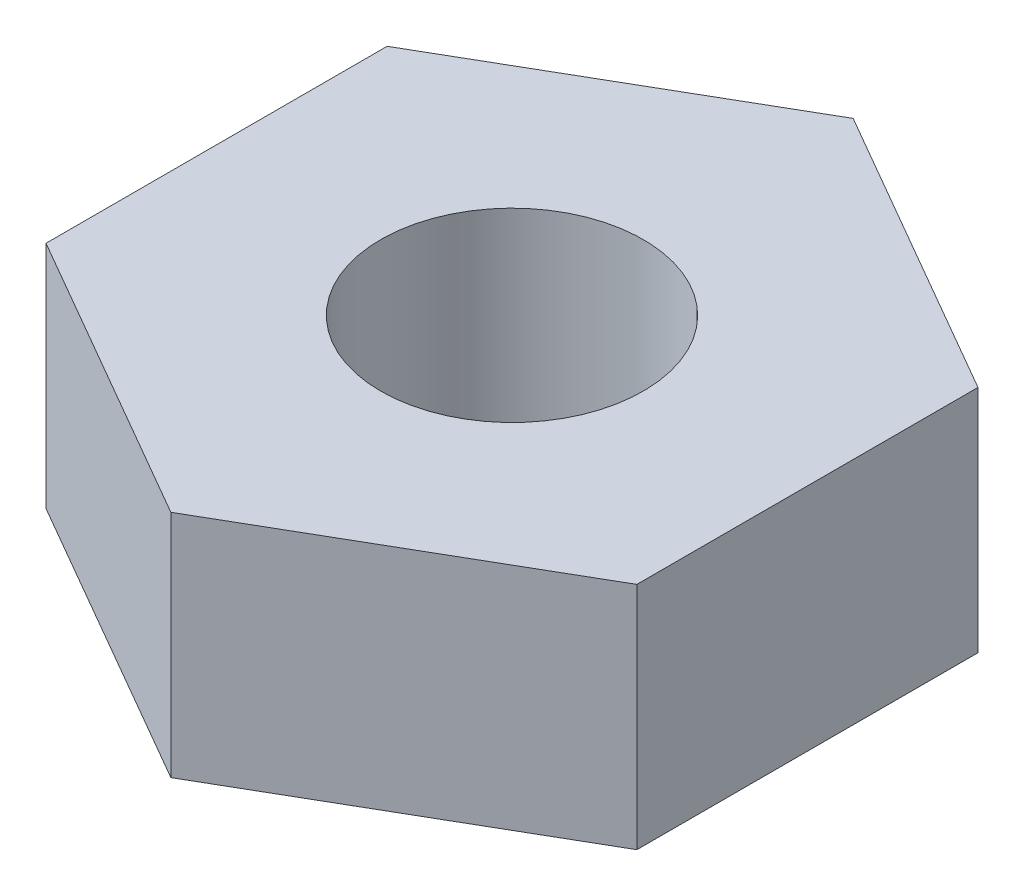
ISO-10303-21;
HEADER;
FILE_DESCRIPTION(('STEP AP214'),'2;1');
FILE_NAME('part.step','',(''),(''),'','','');
FILE_SCHEMA(('AUTOMOTIVE_DESIGN { 1 0 10303 214 1 1 1 1 }'));
ENDSEC;
DATA;
#1=APPLICATION_CONTEXT('core data for automotive mechanical design processes');
#2=APPLICATION_PROTOCOL_DEFINITION('international standard','automotive_design',2000,#1);
#3=PRODUCT_CONTEXT('',#1,'mechanical');
#4=PRODUCT('Part','Part','',(#3));
#5=PRODUCT_RELATED_PRODUCT_CATEGORY('part','',(#4));
#6=PRODUCT_DEFINITION_FORMATION('','',#4);
#7=PRODUCT_DEFINITION_CONTEXT('part definition',#1,'design');
#8=PRODUCT_DEFINITION('design','',#6,#7);
#9=PRODUCT_DEFINITION_SHAPE('','',#8);
#10=(LENGTH_UNIT() NAMED_UNIT(*) SI_UNIT(.MILLI.,.METRE.));
#11=(NAMED_UNIT(*) PLANE_ANGLE_UNIT() SI_UNIT($,.RADIAN.));
#12=(NAMED_UNIT(*) SI_UNIT($,.STERADIAN.) SOLID_ANGLE_UNIT());
#13=UNCERTAINTY_MEASURE_WITH_UNIT(LENGTH_MEASURE(1.E-05),#10,'distance_accuracy_value','');
#14=(GEOMETRIC_REPRESENTATION_CONTEXT(3) GLOBAL_UNCERTAINTY_ASSIGNED_CONTEXT((#13)) GLOBAL_UNIT_ASSIGNED_CONTEXT((#10,
#11,#12)) REPRESENTATION_CONTEXT('',''));
#15=CARTESIAN_POINT('',(0.,0.,0.));
#16=DIRECTION('',(0.,0.,1.));
#17=DIRECTION('',(1.,0.,0.));
#18=AXIS2_PLACEMENT_3D('',#15,#16,#17);
#19=CARTESIAN_POINT('',(0.,1.75,0.));
#20=DIRECTION('',(0.,1.,0.));
#21=DIRECTION('',(0.,0.,1.));
#22=AXIS2_PLACEMENT_3D('',#19,#20,#21);
#23=PLANE('',#22);
#24=DIRECTION('',(-0.866025403784439,0.,-0.5));
#25=VECTOR('',#24,1.);
#26=CARTESIAN_POINT('',(2.25,1.75,-1.29903810567666));
#27=LINE('',#26,#25);
#28=CARTESIAN_POINT('',(2.25,1.75,-1.29903810567666));
#29=VERTEX_POINT('',#28);
#30=CARTESIAN_POINT('',(0.,1.75,-2.59807621135332));
#31=VERTEX_POINT('',#30);
#32=EDGE_CURVE('E149',#29,#31,#27,.T.);
#33=ORIENTED_EDGE('',*,*,#32,.T.);
#34=DIRECTION('',(-0.866025403784439,0.,0.5));
#35=VECTOR('',#34,1.);
#36=CARTESIAN_POINT('',(0.,1.75,-2.59807621135332));
#37=LINE('',#36,#35);
#38=CARTESIAN_POINT('',(-2.25,1.75,-1.29903810567666));
#39=VERTEX_POINT('',#38);
#40=EDGE_CURVE('E97',#31,#39,#37,.T.);
#41=ORIENTED_EDGE('',*,*,#40,.T.);
#42=DIRECTION('',(0.,0.,1.));
#43=VECTOR('',#42,1.);
#44=CARTESIAN_POINT('',(-2.25,1.75,-1.29903810567666));
#45=LINE('',#44,#43);
#46=CARTESIAN_POINT('',(-2.25,1.75,1.29903810567666));
#47=VERTEX_POINT('',#46);
#48=EDGE_CURVE('E110',#39,#47,#45,.T.);
#49=ORIENTED_EDGE('',*,*,#48,.T.);
#50=DIRECTION('',(0.866025403784439,0.,0.5));
#51=VECTOR('',#50,1.);
#52=CARTESIAN_POINT('',(-2.25,1.75,1.29903810567666));
#53=LINE('',#52,#51);
#54=CARTESIAN_POINT('',(0.,1.75,2.59807621135332));
#55=VERTEX_POINT('',#54);
#56=EDGE_CURVE('E104',#47,#55,#53,.T.);
#57=ORIENTED_EDGE('',*,*,#56,.T.);
#58=DIRECTION('',(0.866025403784439,0.,-0.5));
#59=VECTOR('',#58,1.);
#60=CARTESIAN_POINT('',(0.,1.75,2.59807621135332));
#61=LINE('',#60,#59);
#62=CARTESIAN_POINT('',(2.25,1.75,1.29903810567666));
#63=VERTEX_POINT('',#62);
#64=EDGE_CURVE('E108',#55,#63,#61,.T.);
#65=ORIENTED_EDGE('',*,*,#64,.T.);
#66=DIRECTION('',(0.,0.,-1.));
#67=VECTOR('',#66,1.);
#68=CARTESIAN_POINT('',(2.25,1.75,1.29903810567666));
#69=LINE('',#68,#67);
#70=EDGE_CURVE('E60',#63,#29,#69,.T.);
#71=ORIENTED_EDGE('',*,*,#70,.T.);
#72=EDGE_LOOP('',(#33,#41,#49,#57,#65,#71));
#73=FACE_BOUND('',#72,.T.);
#74=CARTESIAN_POINT('',(0.,1.75,0.));
#75=DIRECTION('',(0.,1.,0.));
#76=DIRECTION('',(0.,0.,1.));
#77=AXIS2_PLACEMENT_3D('',#74,#75,#76);
#78=CIRCLE('',#77,1.);
#79=CARTESIAN_POINT('',(0.,1.75,1.));
#80=VERTEX_POINT('',#79);
#81=EDGE_CURVE('E137',#80,#80,#78,.T.);
#82=ORIENTED_EDGE('',*,*,#81,.F.);
#83=EDGE_LOOP('',(#82));
#84=FACE_BOUND('',#83,.T.);
#85=ADVANCED_FACE('F42',(#73,#84),#23,.T.);
#86=CARTESIAN_POINT('',(0.,0.,0.));
#87=DIRECTION('',(0.,1.,0.));
#88=DIRECTION('',(0.,0.,1.));
#89=AXIS2_PLACEMENT_3D('',#86,#87,#88);
#90=PLANE('',#89);
#91=DIRECTION('',(-0.866025403784439,0.,-0.5));
#92=VECTOR('',#91,1.);
#93=CARTESIAN_POINT('',(2.25,0.,-1.29903810567666));
#94=LINE('',#93,#92);
#95=CARTESIAN_POINT('',(2.25,0.,-1.29903810567666));
#96=VERTEX_POINT('',#95);
#97=CARTESIAN_POINT('',(0.,0.,-2.59807621135332));
#98=VERTEX_POINT('',#97);
#99=EDGE_CURVE('E132',#96,#98,#94,.T.);
#100=ORIENTED_EDGE('',*,*,#99,.F.);
#101=DIRECTION('',(0.,0.,-1.));
#102=VECTOR('',#101,1.);
#103=CARTESIAN_POINT('',(2.25,0.,1.29903810567666));
#104=LINE('',#103,#102);
#105=CARTESIAN_POINT('',(2.25,0.,1.29903810567666));
#106=VERTEX_POINT('',#105);
#107=EDGE_CURVE('E89',#106,#96,#104,.T.);
#108=ORIENTED_EDGE('',*,*,#107,.F.);
#109=DIRECTION('',(0.866025403784439,0.,-0.5));
#110=VECTOR('',#109,1.);
#111=CARTESIAN_POINT('',(0.,0.,2.59807621135332));
#112=LINE('',#111,#110);
#113=CARTESIAN_POINT('',(0.,0.,2.59807621135332));
#114=VERTEX_POINT('',#113);
#115=EDGE_CURVE('E83',#114,#106,#112,.T.);
#116=ORIENTED_EDGE('',*,*,#115,.F.);
#117=DIRECTION('',(0.866025403784439,0.,0.5));
#118=VECTOR('',#117,1.);
#119=CARTESIAN_POINT('',(-2.25,0.,1.29903810567666));
#120=LINE('',#119,#118);
#121=CARTESIAN_POINT('',(-2.25,0.,1.29903810567666));
#122=VERTEX_POINT('',#121);
#123=EDGE_CURVE('E119',#122,#114,#120,.T.);
#124=ORIENTED_EDGE('',*,*,#123,.F.);
#125=DIRECTION('',(0.,0.,1.));
#126=VECTOR('',#125,1.);
#127=CARTESIAN_POINT('',(-2.25,0.,-1.29903810567666));
#128=LINE('',#127,#126);
#129=CARTESIAN_POINT('',(-2.25,0.,-1.29903810567666));
#130=VERTEX_POINT('',#129);
#131=EDGE_CURVE('E140',#130,#122,#128,.T.);
#132=ORIENTED_EDGE('',*,*,#131,.F.);
#133=DIRECTION('',(-0.866025403784439,0.,0.5));
#134=VECTOR('',#133,1.);
#135=CARTESIAN_POINT('',(0.,0.,-2.59807621135332));
#136=LINE('',#135,#134);
#137=EDGE_CURVE('E136',#98,#130,#136,.T.);
#138=ORIENTED_EDGE('',*,*,#137,.F.);
#139=EDGE_LOOP('',(#100,#108,#116,#124,#132,#138));
#140=FACE_BOUND('',#139,.T.);
#141=CARTESIAN_POINT('',(0.,0.,0.));
#142=DIRECTION('',(0.,1.,0.));
#143=DIRECTION('',(0.,0.,1.));
#144=AXIS2_PLACEMENT_3D('',#141,#142,#143);
#145=CIRCLE('',#144,1.);
#146=CARTESIAN_POINT('',(0.,0.,1.));
#147=VERTEX_POINT('',#146);
#148=EDGE_CURVE('E248',#147,#147,#145,.T.);
#149=ORIENTED_EDGE('',*,*,#148,.T.);
#150=EDGE_LOOP('',(#149));
#151=FACE_BOUND('',#150,.T.);
#152=ADVANCED_FACE('F162',(#140,#151),#90,.F.);
#153=CARTESIAN_POINT('',(2.25,1.75,-1.29903810567666));
#154=DIRECTION('',(-0.5,0.,0.866025403784439));
#155=DIRECTION('',(0.866025403784439,0.,0.5));
#156=AXIS2_PLACEMENT_3D('',#153,#154,#155);
#157=PLANE('',#156);
#158=ORIENTED_EDGE('',*,*,#99,.T.);
#159=DIRECTION('',(0.,-1.,0.));
#160=VECTOR('',#159,1.);
#161=CARTESIAN_POINT('',(0.,1.75,-2.59807621135332));
#162=LINE('',#161,#160);
#163=EDGE_CURVE('E11',#31,#98,#162,.T.);
#164=ORIENTED_EDGE('',*,*,#163,.F.);
#165=ORIENTED_EDGE('',*,*,#32,.F.);
#166=DIRECTION('',(0.,-1.,0.));
#167=VECTOR('',#166,1.);
#168=CARTESIAN_POINT('',(2.25,1.75,-1.29903810567666));
#169=LINE('',#168,#167);
#170=EDGE_CURVE('E128',#29,#96,#169,.T.);
#171=ORIENTED_EDGE('',*,*,#170,.T.);
#172=EDGE_LOOP('',(#158,#164,#165,#171));
#173=FACE_BOUND('',#172,.T.);
#174=ADVANCED_FACE('F44',(#173),#157,.F.);
#175=CARTESIAN_POINT('',(0.,1.75,-2.59807621135332));
#176=DIRECTION('',(0.5,0.,0.866025403784439));
#177=DIRECTION('',(0.866025403784439,0.,-0.5));
#178=AXIS2_PLACEMENT_3D('',#175,#176,#177);
#179=PLANE('',#178);
#180=ORIENTED_EDGE('',*,*,#137,.T.);
#181=DIRECTION('',(0.,-1.,0.));
#182=VECTOR('',#181,1.);
#183=CARTESIAN_POINT('',(-2.25,1.75,-1.29903810567666));
#184=LINE('',#183,#182);
#185=EDGE_CURVE('E52',#39,#130,#184,.T.);
#186=ORIENTED_EDGE('',*,*,#185,.F.);
#187=ORIENTED_EDGE('',*,*,#40,.F.);
#188=ORIENTED_EDGE('',*,*,#163,.T.);
#189=EDGE_LOOP('',(#180,#186,#187,#188));
#190=FACE_BOUND('',#189,.T.);
#191=ADVANCED_FACE('F187',(#190),#179,.F.);
#192=CARTESIAN_POINT('',(-2.25,1.75,-1.29903810567666));
#193=DIRECTION('',(1.,0.,0.));
#194=DIRECTION('',(0.,0.,-1.));
#195=AXIS2_PLACEMENT_3D('',#192,#193,#194);
#196=PLANE('',#195);
#197=ORIENTED_EDGE('',*,*,#131,.T.);
#198=DIRECTION('',(0.,-1.,0.));
#199=VECTOR('',#198,1.);
#200=CARTESIAN_POINT('',(-2.25,1.75,1.29903810567666));
#201=LINE('',#200,#199);
#202=EDGE_CURVE('E121',#47,#122,#201,.T.);
#203=ORIENTED_EDGE('',*,*,#202,.F.);
#204=ORIENTED_EDGE('',*,*,#48,.F.);
#205=ORIENTED_EDGE('',*,*,#185,.T.);
#206=EDGE_LOOP('',(#197,#203,#204,#205));
#207=FACE_BOUND('',#206,.T.);
#208=ADVANCED_FACE('F159',(#207),#196,.F.);
#209=CARTESIAN_POINT('',(-2.25,1.75,1.29903810567666));
#210=DIRECTION('',(0.5,0.,-0.866025403784439));
#211=DIRECTION('',(-0.866025403784439,0.,-0.5));
#212=AXIS2_PLACEMENT_3D('',#209,#210,#211);
#213=PLANE('',#212);
#214=ORIENTED_EDGE('',*,*,#123,.T.);
#215=DIRECTION('',(0.,-1.,0.));
#216=VECTOR('',#215,1.);
#217=CARTESIAN_POINT('',(0.,1.75,2.59807621135332));
#218=LINE('',#217,#216);
#219=EDGE_CURVE('E116',#55,#114,#218,.T.);
#220=ORIENTED_EDGE('',*,*,#219,.F.);
#221=ORIENTED_EDGE('',*,*,#56,.F.);
#222=ORIENTED_EDGE('',*,*,#202,.T.);
#223=EDGE_LOOP('',(#214,#220,#221,#222));
#224=FACE_BOUND('',#223,.T.);
#225=ADVANCED_FACE('F117',(#224),#213,.F.);
#226=CARTESIAN_POINT('',(0.,1.75,2.59807621135332));
#227=DIRECTION('',(-0.5,0.,-0.866025403784439));
#228=DIRECTION('',(-0.866025403784439,0.,0.5));
#229=AXIS2_PLACEMENT_3D('',#226,#227,#228);
#230=PLANE('',#229);
#231=ORIENTED_EDGE('',*,*,#115,.T.);
#232=DIRECTION('',(0.,-1.,0.));
#233=VECTOR('',#232,1.);
#234=CARTESIAN_POINT('',(2.25,1.75,1.29903810567666));
#235=LINE('',#234,#233);
#236=EDGE_CURVE('E122',#63,#106,#235,.T.);
#237=ORIENTED_EDGE('',*,*,#236,.F.);
#238=ORIENTED_EDGE('',*,*,#64,.F.);
#239=ORIENTED_EDGE('',*,*,#219,.T.);
#240=EDGE_LOOP('',(#231,#237,#238,#239));
#241=FACE_BOUND('',#240,.T.);
#242=ADVANCED_FACE('F124',(#241),#230,.F.);
#243=CARTESIAN_POINT('',(2.25,1.75,1.29903810567666));
#244=DIRECTION('',(-1.,0.,0.));
#245=DIRECTION('',(0.,0.,1.));
#246=AXIS2_PLACEMENT_3D('',#243,#244,#245);
#247=PLANE('',#246);
#248=ORIENTED_EDGE('',*,*,#107,.T.);
#249=ORIENTED_EDGE('',*,*,#170,.F.);
#250=ORIENTED_EDGE('',*,*,#70,.F.);
#251=ORIENTED_EDGE('',*,*,#236,.T.);
#252=EDGE_LOOP('',(#248,#249,#250,#251));
#253=FACE_BOUND('',#252,.T.);
#254=ADVANCED_FACE('F167',(#253),#247,.F.);
#255=CARTESIAN_POINT('',(0.,1.75,0.));
#256=DIRECTION('',(0.,-1.,0.));
#257=DIRECTION('',(0.,0.,-1.));
#258=AXIS2_PLACEMENT_3D('',#255,#256,#257);
#259=CYLINDRICAL_SURFACE('',#258,1.);
#260=ORIENTED_EDGE('',*,*,#81,.T.);
#261=EDGE_LOOP('',(#260));
#262=FACE_BOUND('',#261,.T.);
#263=ORIENTED_EDGE('',*,*,#148,.F.);
#264=EDGE_LOOP('',(#263));
#265=FACE_BOUND('',#264,.T.);
#266=ADVANCED_FACE('F169',(#262,#265),#259,.F.);
#267=CLOSED_SHELL('',(#85,#152,#174,#191,#208,#225,#242,#254,#266));
#268=MANIFOLD_SOLID_BREP('B2',#267);
#269=ADVANCED_BREP_SHAPE_REPRESENTATION('',(#18,#268),#14);
#270=SHAPE_DEFINITION_REPRESENTATION(#9,#269);
ENDSEC;
END-ISO-10303-21;
